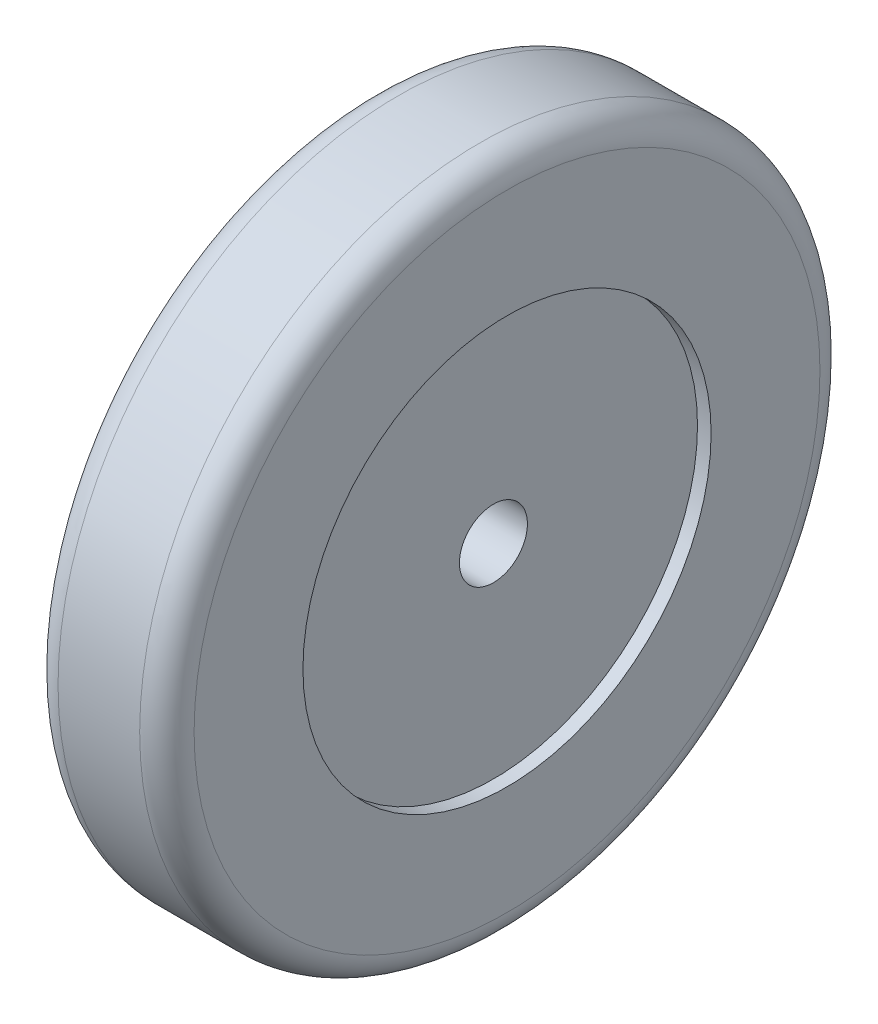
ISO-10303-21;
HEADER;
FILE_DESCRIPTION(('STEP AP214'),'2;1');
FILE_NAME('part.step','',(''),(''),'','','');
FILE_SCHEMA(('AUTOMOTIVE_DESIGN { 1 0 10303 214 1 1 1 1 }'));
ENDSEC;
DATA;
#1=APPLICATION_CONTEXT('core data for automotive mechanical design processes');
#2=APPLICATION_PROTOCOL_DEFINITION('international standard','automotive_design',2000,#1);
#3=PRODUCT_CONTEXT('',#1,'mechanical');
#4=PRODUCT('Part','Part','',(#3));
#5=PRODUCT_RELATED_PRODUCT_CATEGORY('part','',(#4));
#6=PRODUCT_DEFINITION_FORMATION('','',#4);
#7=PRODUCT_DEFINITION_CONTEXT('part definition',#1,'design');
#8=PRODUCT_DEFINITION('design','',#6,#7);
#9=PRODUCT_DEFINITION_SHAPE('','',#8);
#10=(LENGTH_UNIT() NAMED_UNIT(*) SI_UNIT(.MILLI.,.METRE.));
#11=(NAMED_UNIT(*) PLANE_ANGLE_UNIT() SI_UNIT($,.RADIAN.));
#12=(NAMED_UNIT(*) SI_UNIT($,.STERADIAN.) SOLID_ANGLE_UNIT());
#13=UNCERTAINTY_MEASURE_WITH_UNIT(LENGTH_MEASURE(1.E-05),#10,'distance_accuracy_value','');
#14=(GEOMETRIC_REPRESENTATION_CONTEXT(3) GLOBAL_UNCERTAINTY_ASSIGNED_CONTEXT((#13)) GLOBAL_UNIT_ASSIGNED_CONTEXT((#10,
#11,#12)) REPRESENTATION_CONTEXT('',''));
#15=CARTESIAN_POINT('',(0.,0.,0.));
#16=DIRECTION('',(0.,0.,1.));
#17=DIRECTION('',(1.,0.,0.));
#18=AXIS2_PLACEMENT_3D('',#15,#16,#17);
#19=CARTESIAN_POINT('',(-6.35,0.,0.));
#20=DIRECTION('',(1.,0.,0.));
#21=DIRECTION('',(0.,0.,-1.));
#22=AXIS2_PLACEMENT_3D('',#19,#20,#21);
#23=CYLINDRICAL_SURFACE('',#22,3.175);
#24=CARTESIAN_POINT('',(5.08,0.,0.));
#25=DIRECTION('',(1.,0.,0.));
#26=DIRECTION('',(0.,0.,-1.));
#27=AXIS2_PLACEMENT_3D('',#24,#25,#26);
#28=CIRCLE('',#27,3.175);
#29=CARTESIAN_POINT('',(5.08,0.,-3.175));
#30=VERTEX_POINT('',#29);
#31=EDGE_CURVE('E67',#30,#30,#28,.F.);
#32=ORIENTED_EDGE('',*,*,#31,.F.);
#33=EDGE_LOOP('',(#32));
#34=FACE_BOUND('',#33,.T.);
#35=CARTESIAN_POINT('',(-5.08,0.,0.));
#36=DIRECTION('',(-1.,0.,0.));
#37=DIRECTION('',(0.,0.,1.));
#38=AXIS2_PLACEMENT_3D('',#35,#36,#37);
#39=CIRCLE('',#38,3.175);
#40=CARTESIAN_POINT('',(-5.08,0.,3.175));
#41=VERTEX_POINT('',#40);
#42=EDGE_CURVE('E53',#41,#41,#39,.F.);
#43=ORIENTED_EDGE('',*,*,#42,.F.);
#44=EDGE_LOOP('',(#43));
#45=FACE_BOUND('',#44,.T.);
#46=ADVANCED_FACE('F49',(#34,#45),#23,.F.);
#47=CARTESIAN_POINT('',(6.35,0.,0.));
#48=DIRECTION('',(-1.,0.,0.));
#49=DIRECTION('',(0.,0.,1.));
#50=AXIS2_PLACEMENT_3D('',#47,#48,#49);
#51=CYLINDRICAL_SURFACE('',#50,31.75);
#52=CARTESIAN_POINT('',(-3.81,0.,0.));
#53=DIRECTION('',(1.,0.,0.));
#54=DIRECTION('',(0.,0.,-1.));
#55=AXIS2_PLACEMENT_3D('',#52,#53,#54);
#56=CIRCLE('',#55,31.75);
#57=CARTESIAN_POINT('',(-3.81,0.,-31.75));
#58=VERTEX_POINT('',#57);
#59=EDGE_CURVE('E64',#58,#58,#56,.T.);
#60=ORIENTED_EDGE('',*,*,#59,.T.);
#61=EDGE_LOOP('',(#60));
#62=FACE_BOUND('',#61,.T.);
#63=CARTESIAN_POINT('',(3.81,0.,0.));
#64=DIRECTION('',(1.,0.,0.));
#65=DIRECTION('',(0.,0.,-1.));
#66=AXIS2_PLACEMENT_3D('',#63,#64,#65);
#67=CIRCLE('',#66,31.75);
#68=CARTESIAN_POINT('',(3.81,0.,-31.75));
#69=VERTEX_POINT('',#68);
#70=EDGE_CURVE('E70',#69,#69,#67,.F.);
#71=ORIENTED_EDGE('',*,*,#70,.T.);
#72=EDGE_LOOP('',(#71));
#73=FACE_BOUND('',#72,.T.);
#74=ADVANCED_FACE('F93',(#62,#73),#51,.T.);
#75=CARTESIAN_POINT('',(6.35,0.,0.));
#76=DIRECTION('',(1.,0.,0.));
#77=DIRECTION('',(0.,0.,-1.));
#78=AXIS2_PLACEMENT_3D('',#75,#76,#77);
#79=PLANE('',#78);
#80=CARTESIAN_POINT('',(6.35,0.,0.));
#81=DIRECTION('',(1.,0.,0.));
#82=DIRECTION('',(0.,0.,-1.));
#83=AXIS2_PLACEMENT_3D('',#80,#81,#82);
#84=CIRCLE('',#83,19.05);
#85=CARTESIAN_POINT('',(6.35,0.,-19.05));
#86=VERTEX_POINT('',#85);
#87=EDGE_CURVE('E79',#86,#86,#84,.T.);
#88=ORIENTED_EDGE('',*,*,#87,.F.);
#89=EDGE_LOOP('',(#88));
#90=FACE_BOUND('',#89,.T.);
#91=CARTESIAN_POINT('',(6.35,0.,0.));
#92=DIRECTION('',(1.,0.,0.));
#93=DIRECTION('',(0.,0.,-1.));
#94=AXIS2_PLACEMENT_3D('',#91,#92,#93);
#95=CIRCLE('',#94,29.21);
#96=CARTESIAN_POINT('',(6.35,0.,-29.21));
#97=VERTEX_POINT('',#96);
#98=EDGE_CURVE('E10',#97,#97,#95,.T.);
#99=ORIENTED_EDGE('',*,*,#98,.T.);
#100=EDGE_LOOP('',(#99));
#101=FACE_BOUND('',#100,.T.);
#102=ADVANCED_FACE('F107',(#90,#101),#79,.T.);
#103=CARTESIAN_POINT('',(-6.35,0.,0.));
#104=DIRECTION('',(1.,0.,0.));
#105=DIRECTION('',(0.,0.,-1.));
#106=AXIS2_PLACEMENT_3D('',#103,#104,#105);
#107=PLANE('',#106);
#108=CARTESIAN_POINT('',(-6.35,0.,0.));
#109=DIRECTION('',(1.,0.,0.));
#110=DIRECTION('',(0.,0.,-1.));
#111=AXIS2_PLACEMENT_3D('',#108,#109,#110);
#112=CIRCLE('',#111,19.05);
#113=CARTESIAN_POINT('',(-6.35,0.,-19.05));
#114=VERTEX_POINT('',#113);
#115=EDGE_CURVE('E87',#114,#114,#112,.T.);
#116=ORIENTED_EDGE('',*,*,#115,.T.);
#117=EDGE_LOOP('',(#116));
#118=FACE_BOUND('',#117,.T.);
#119=CARTESIAN_POINT('',(-6.35,0.,0.));
#120=DIRECTION('',(1.,0.,0.));
#121=DIRECTION('',(0.,0.,-1.));
#122=AXIS2_PLACEMENT_3D('',#119,#120,#121);
#123=CIRCLE('',#122,29.21);
#124=CARTESIAN_POINT('',(-6.35,0.,-29.21));
#125=VERTEX_POINT('',#124);
#126=EDGE_CURVE('E58',#125,#125,#123,.F.);
#127=ORIENTED_EDGE('',*,*,#126,.T.);
#128=EDGE_LOOP('',(#127));
#129=FACE_BOUND('',#128,.T.);
#130=ADVANCED_FACE('F98',(#118,#129),#107,.F.);
#131=CARTESIAN_POINT('',(-3.81,0.,0.));
#132=DIRECTION('',(1.,0.,0.));
#133=DIRECTION('',(0.,0.,-1.));
#134=AXIS2_PLACEMENT_3D('',#131,#132,#133);
#135=TOROIDAL_SURFACE('',#134,29.21,2.54);
#136=ORIENTED_EDGE('',*,*,#126,.F.);
#137=EDGE_LOOP('',(#136));
#138=FACE_BOUND('',#137,.T.);
#139=ORIENTED_EDGE('',*,*,#59,.F.);
#140=EDGE_LOOP('',(#139));
#141=FACE_BOUND('',#140,.T.);
#142=ADVANCED_FACE('F96',(#138,#141),#135,.T.);
#143=CARTESIAN_POINT('',(3.81,0.,0.));
#144=DIRECTION('',(1.,0.,0.));
#145=DIRECTION('',(0.,0.,-1.));
#146=AXIS2_PLACEMENT_3D('',#143,#144,#145);
#147=TOROIDAL_SURFACE('',#146,29.21,2.54);
#148=ORIENTED_EDGE('',*,*,#70,.F.);
#149=EDGE_LOOP('',(#148));
#150=FACE_BOUND('',#149,.T.);
#151=ORIENTED_EDGE('',*,*,#98,.F.);
#152=EDGE_LOOP('',(#151));
#153=FACE_BOUND('',#152,.T.);
#154=ADVANCED_FACE('F51',(#150,#153),#147,.T.);
#155=CARTESIAN_POINT('',(5.08,0.,0.));
#156=DIRECTION('',(1.,0.,0.));
#157=DIRECTION('',(0.,0.,-1.));
#158=AXIS2_PLACEMENT_3D('',#155,#156,#157);
#159=PLANE('',#158);
#160=CARTESIAN_POINT('',(5.08,0.,0.));
#161=DIRECTION('',(1.,0.,0.));
#162=DIRECTION('',(0.,0.,-1.));
#163=AXIS2_PLACEMENT_3D('',#160,#161,#162);
#164=CIRCLE('',#163,19.05);
#165=CARTESIAN_POINT('',(5.08,0.,-19.05));
#166=VERTEX_POINT('',#165);
#167=EDGE_CURVE('E71',#166,#166,#164,.T.);
#168=ORIENTED_EDGE('',*,*,#167,.T.);
#169=EDGE_LOOP('',(#168));
#170=FACE_BOUND('',#169,.T.);
#171=ORIENTED_EDGE('',*,*,#31,.T.);
#172=EDGE_LOOP('',(#171));
#173=FACE_BOUND('',#172,.T.);
#174=ADVANCED_FACE('F104',(#170,#173),#159,.T.);
#175=CARTESIAN_POINT('',(5.08,0.,0.));
#176=DIRECTION('',(1.,0.,0.));
#177=DIRECTION('',(0.,0.,-1.));
#178=AXIS2_PLACEMENT_3D('',#175,#176,#177);
#179=CYLINDRICAL_SURFACE('',#178,19.05);
#180=ORIENTED_EDGE('',*,*,#167,.F.);
#181=EDGE_LOOP('',(#180));
#182=FACE_BOUND('',#181,.T.);
#183=ORIENTED_EDGE('',*,*,#87,.T.);
#184=EDGE_LOOP('',(#183));
#185=FACE_BOUND('',#184,.T.);
#186=ADVANCED_FACE('F121',(#182,#185),#179,.F.);
#187=CARTESIAN_POINT('',(-5.08,0.,0.));
#188=DIRECTION('',(-1.,0.,0.));
#189=DIRECTION('',(0.,0.,-1.));
#190=AXIS2_PLACEMENT_3D('',#187,#188,#189);
#191=PLANE('',#190);
#192=CARTESIAN_POINT('',(-5.08,0.,0.));
#193=DIRECTION('',(1.,0.,0.));
#194=DIRECTION('',(0.,0.,-1.));
#195=AXIS2_PLACEMENT_3D('',#192,#193,#194);
#196=CIRCLE('',#195,19.05);
#197=CARTESIAN_POINT('',(-5.08,0.,-19.05));
#198=VERTEX_POINT('',#197);
#199=EDGE_CURVE('E151',#198,#198,#196,.T.);
#200=ORIENTED_EDGE('',*,*,#199,.F.);
#201=EDGE_LOOP('',(#200));
#202=FACE_BOUND('',#201,.T.);
#203=ORIENTED_EDGE('',*,*,#42,.T.);
#204=EDGE_LOOP('',(#203));
#205=FACE_BOUND('',#204,.T.);
#206=ADVANCED_FACE('F131',(#202,#205),#191,.T.);
#207=CARTESIAN_POINT('',(-5.08,0.,0.));
#208=DIRECTION('',(-1.,0.,0.));
#209=DIRECTION('',(0.,0.,1.));
#210=AXIS2_PLACEMENT_3D('',#207,#208,#209);
#211=CYLINDRICAL_SURFACE('',#210,19.05);
#212=ORIENTED_EDGE('',*,*,#199,.T.);
#213=EDGE_LOOP('',(#212));
#214=FACE_BOUND('',#213,.T.);
#215=ORIENTED_EDGE('',*,*,#115,.F.);
#216=EDGE_LOOP('',(#215));
#217=FACE_BOUND('',#216,.T.);
#218=ADVANCED_FACE('F137',(#214,#217),#211,.F.);
#219=CLOSED_SHELL('',(#46,#74,#102,#130,#142,#154,#174,#186,#206,#218));
#220=MANIFOLD_SOLID_BREP('B2',#219);
#221=ADVANCED_BREP_SHAPE_REPRESENTATION('',(#18,#220),#14);
#222=SHAPE_DEFINITION_REPRESENTATION(#9,#221);
ENDSEC;
END-ISO-10303-21;
